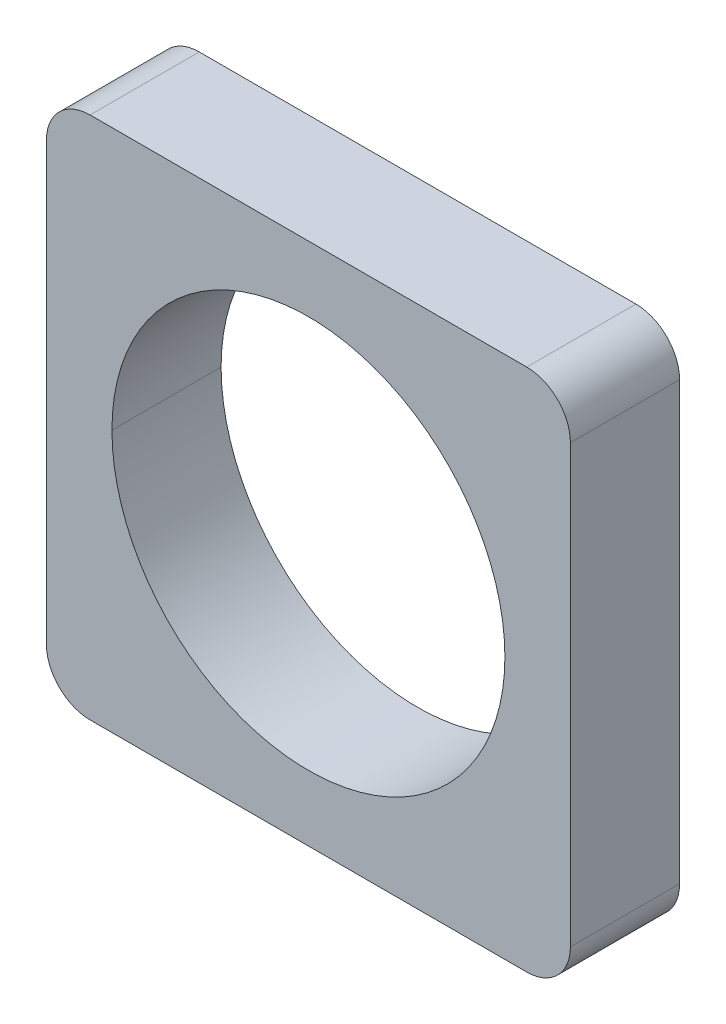
ISO-10303-21;
HEADER;
FILE_DESCRIPTION(('STEP AP214'),'2;1');
FILE_NAME('part.step','',(''),(''),'','','');
FILE_SCHEMA(('AUTOMOTIVE_DESIGN { 1 0 10303 214 1 1 1 1 }'));
ENDSEC;
DATA;
#1=APPLICATION_CONTEXT('core data for automotive mechanical design processes');
#2=APPLICATION_PROTOCOL_DEFINITION('international standard','automotive_design',2000,#1);
#3=PRODUCT_CONTEXT('',#1,'mechanical');
#4=PRODUCT('Part','Part','',(#3));
#5=PRODUCT_RELATED_PRODUCT_CATEGORY('part','',(#4));
#6=PRODUCT_DEFINITION_FORMATION('','',#4);
#7=PRODUCT_DEFINITION_CONTEXT('part definition',#1,'design');
#8=PRODUCT_DEFINITION('design','',#6,#7);
#9=PRODUCT_DEFINITION_SHAPE('','',#8);
#10=(LENGTH_UNIT() NAMED_UNIT(*) SI_UNIT(.MILLI.,.METRE.));
#11=(NAMED_UNIT(*) PLANE_ANGLE_UNIT() SI_UNIT($,.RADIAN.));
#12=(NAMED_UNIT(*) SI_UNIT($,.STERADIAN.) SOLID_ANGLE_UNIT());
#13=UNCERTAINTY_MEASURE_WITH_UNIT(LENGTH_MEASURE(1.E-05),#10,'distance_accuracy_value','');
#14=(GEOMETRIC_REPRESENTATION_CONTEXT(3) GLOBAL_UNCERTAINTY_ASSIGNED_CONTEXT((#13)) GLOBAL_UNIT_ASSIGNED_CONTEXT((#10,
#11,#12)) REPRESENTATION_CONTEXT('',''));
#15=CARTESIAN_POINT('',(0.,0.,0.));
#16=DIRECTION('',(0.,0.,1.));
#17=DIRECTION('',(1.,0.,0.));
#18=AXIS2_PLACEMENT_3D('',#15,#16,#17);
#19=CARTESIAN_POINT('',(-6.,6.,0.));
#20=DIRECTION('',(-1.,0.,0.));
#21=DIRECTION('',(0.,0.,1.));
#22=AXIS2_PLACEMENT_3D('',#19,#20,#21);
#23=PLANE('',#22);
#24=DIRECTION('',(0.,-1.,0.));
#25=VECTOR('',#24,1.);
#26=CARTESIAN_POINT('',(-6.,5.,0.));
#27=LINE('',#26,#25);
#28=CARTESIAN_POINT('',(-6.,5.,0.));
#29=VERTEX_POINT('',#28);
#30=CARTESIAN_POINT('',(-6.,-5.,0.));
#31=VERTEX_POINT('',#30);
#32=EDGE_CURVE('E173',#29,#31,#27,.T.);
#33=ORIENTED_EDGE('',*,*,#32,.T.);
#34=DIRECTION('',(0.,0.,-1.));
#35=VECTOR('',#34,1.);
#36=CARTESIAN_POINT('',(-6.,-5.,2.5));
#37=LINE('',#36,#35);
#38=CARTESIAN_POINT('',(-6.,-5.,2.5));
#39=VERTEX_POINT('',#38);
#40=EDGE_CURVE('E11',#39,#31,#37,.T.);
#41=ORIENTED_EDGE('',*,*,#40,.F.);
#42=DIRECTION('',(0.,-1.,0.));
#43=VECTOR('',#42,1.);
#44=CARTESIAN_POINT('',(-6.,5.,2.5));
#45=LINE('',#44,#43);
#46=CARTESIAN_POINT('',(-6.,5.,2.5));
#47=VERTEX_POINT('',#46);
#48=EDGE_CURVE('E21',#47,#39,#45,.T.);
#49=ORIENTED_EDGE('',*,*,#48,.F.);
#50=DIRECTION('',(0.,0.,-1.));
#51=VECTOR('',#50,1.);
#52=CARTESIAN_POINT('',(-6.,5.,2.5));
#53=LINE('',#52,#51);
#54=EDGE_CURVE('E162',#47,#29,#53,.T.);
#55=ORIENTED_EDGE('',*,*,#54,.T.);
#56=EDGE_LOOP('',(#33,#41,#49,#55));
#57=FACE_BOUND('',#56,.T.);
#58=ADVANCED_FACE('F17',(#57),#23,.T.);
#59=CARTESIAN_POINT('',(-5.,-5.,5.759));
#60=DIRECTION('',(0.,0.,-1.));
#61=DIRECTION('',(0.,-1.,0.));
#62=AXIS2_PLACEMENT_3D('',#59,#60,#61);
#63=CYLINDRICAL_SURFACE('',#62,1.);
#64=DIRECTION('',(0.,0.,-1.));
#65=VECTOR('',#64,1.);
#66=CARTESIAN_POINT('',(-5.,-6.,2.5));
#67=LINE('',#66,#65);
#68=CARTESIAN_POINT('',(-5.,-6.,2.5));
#69=VERTEX_POINT('',#68);
#70=CARTESIAN_POINT('',(-5.,-6.,0.));
#71=VERTEX_POINT('',#70);
#72=EDGE_CURVE('E28',#69,#71,#67,.T.);
#73=ORIENTED_EDGE('',*,*,#72,.F.);
#74=CARTESIAN_POINT('',(-5.,-5.,2.5));
#75=DIRECTION('',(0.,0.,1.));
#76=DIRECTION('',(-1.,0.,0.));
#77=AXIS2_PLACEMENT_3D('',#74,#75,#76);
#78=CIRCLE('',#77,1.);
#79=EDGE_CURVE('E192',#39,#69,#78,.T.);
#80=ORIENTED_EDGE('',*,*,#79,.F.);
#81=ORIENTED_EDGE('',*,*,#40,.T.);
#82=CARTESIAN_POINT('',(-5.,-5.,0.));
#83=DIRECTION('',(0.,0.,-1.));
#84=DIRECTION('',(0.,-1.,0.));
#85=AXIS2_PLACEMENT_3D('',#82,#83,#84);
#86=CIRCLE('',#85,1.);
#87=EDGE_CURVE('E178',#71,#31,#86,.T.);
#88=ORIENTED_EDGE('',*,*,#87,.F.);
#89=EDGE_LOOP('',(#73,#80,#81,#88));
#90=FACE_BOUND('',#89,.T.);
#91=ADVANCED_FACE('F227',(#90),#63,.T.);
#92=CARTESIAN_POINT('',(-6.,-6.,0.));
#93=DIRECTION('',(0.,-1.,0.));
#94=DIRECTION('',(0.,0.,-1.));
#95=AXIS2_PLACEMENT_3D('',#92,#93,#94);
#96=PLANE('',#95);
#97=DIRECTION('',(1.,0.,0.));
#98=VECTOR('',#97,1.);
#99=CARTESIAN_POINT('',(-5.,-6.,0.));
#100=LINE('',#99,#98);
#101=CARTESIAN_POINT('',(5.,-6.,0.));
#102=VERTEX_POINT('',#101);
#103=EDGE_CURVE('E204',#71,#102,#100,.T.);
#104=ORIENTED_EDGE('',*,*,#103,.T.);
#105=DIRECTION('',(0.,0.,-1.));
#106=VECTOR('',#105,1.);
#107=CARTESIAN_POINT('',(5.,-6.,2.5));
#108=LINE('',#107,#106);
#109=CARTESIAN_POINT('',(5.,-6.,2.5));
#110=VERTEX_POINT('',#109);
#111=EDGE_CURVE('E91',#110,#102,#108,.T.);
#112=ORIENTED_EDGE('',*,*,#111,.F.);
#113=DIRECTION('',(1.,0.,0.));
#114=VECTOR('',#113,1.);
#115=CARTESIAN_POINT('',(-5.,-6.,2.5));
#116=LINE('',#115,#114);
#117=EDGE_CURVE('E156',#69,#110,#116,.T.);
#118=ORIENTED_EDGE('',*,*,#117,.F.);
#119=ORIENTED_EDGE('',*,*,#72,.T.);
#120=EDGE_LOOP('',(#104,#112,#118,#119));
#121=FACE_BOUND('',#120,.T.);
#122=ADVANCED_FACE('F232',(#121),#96,.T.);
#123=CARTESIAN_POINT('',(5.,-5.,5.759));
#124=DIRECTION('',(0.,0.,-1.));
#125=DIRECTION('',(1.,0.,0.));
#126=AXIS2_PLACEMENT_3D('',#123,#124,#125);
#127=CYLINDRICAL_SURFACE('',#126,1.);
#128=DIRECTION('',(0.,0.,-1.));
#129=VECTOR('',#128,1.);
#130=CARTESIAN_POINT('',(6.,-5.,2.5));
#131=LINE('',#130,#129);
#132=CARTESIAN_POINT('',(6.,-5.,2.5));
#133=VERTEX_POINT('',#132);
#134=CARTESIAN_POINT('',(6.,-5.,0.));
#135=VERTEX_POINT('',#134);
#136=EDGE_CURVE('E107',#133,#135,#131,.T.);
#137=ORIENTED_EDGE('',*,*,#136,.F.);
#138=CARTESIAN_POINT('',(5.,-5.,2.5));
#139=DIRECTION('',(0.,0.,1.));
#140=DIRECTION('',(0.,-1.,0.));
#141=AXIS2_PLACEMENT_3D('',#138,#139,#140);
#142=CIRCLE('',#141,1.);
#143=EDGE_CURVE('E149',#110,#133,#142,.T.);
#144=ORIENTED_EDGE('',*,*,#143,.F.);
#145=ORIENTED_EDGE('',*,*,#111,.T.);
#146=CARTESIAN_POINT('',(5.,-5.,0.));
#147=DIRECTION('',(0.,0.,-1.));
#148=DIRECTION('',(1.,0.,0.));
#149=AXIS2_PLACEMENT_3D('',#146,#147,#148);
#150=CIRCLE('',#149,1.);
#151=EDGE_CURVE('E169',#135,#102,#150,.T.);
#152=ORIENTED_EDGE('',*,*,#151,.F.);
#153=EDGE_LOOP('',(#137,#144,#145,#152));
#154=FACE_BOUND('',#153,.T.);
#155=ADVANCED_FACE('F19',(#154),#127,.T.);
#156=CARTESIAN_POINT('',(6.,-6.,0.));
#157=DIRECTION('',(1.,0.,0.));
#158=DIRECTION('',(0.,1.,0.));
#159=AXIS2_PLACEMENT_3D('',#156,#157,#158);
#160=PLANE('',#159);
#161=DIRECTION('',(0.,1.,0.));
#162=VECTOR('',#161,1.);
#163=CARTESIAN_POINT('',(6.,-5.,2.5));
#164=LINE('',#163,#162);
#165=CARTESIAN_POINT('',(6.,5.,2.5));
#166=VERTEX_POINT('',#165);
#167=EDGE_CURVE('E128',#133,#166,#164,.T.);
#168=ORIENTED_EDGE('',*,*,#167,.F.);
#169=ORIENTED_EDGE('',*,*,#136,.T.);
#170=DIRECTION('',(0.,1.,0.));
#171=VECTOR('',#170,1.);
#172=CARTESIAN_POINT('',(6.,-5.,0.));
#173=LINE('',#172,#171);
#174=CARTESIAN_POINT('',(6.,5.,0.));
#175=VERTEX_POINT('',#174);
#176=EDGE_CURVE('E131',#135,#175,#173,.T.);
#177=ORIENTED_EDGE('',*,*,#176,.T.);
#178=DIRECTION('',(0.,0.,-1.));
#179=VECTOR('',#178,1.);
#180=CARTESIAN_POINT('',(6.,5.,2.5));
#181=LINE('',#180,#179);
#182=EDGE_CURVE('E124',#166,#175,#181,.T.);
#183=ORIENTED_EDGE('',*,*,#182,.F.);
#184=EDGE_LOOP('',(#168,#169,#177,#183));
#185=FACE_BOUND('',#184,.T.);
#186=ADVANCED_FACE('F126',(#185),#160,.T.);
#187=CARTESIAN_POINT('',(5.,5.,5.759));
#188=DIRECTION('',(0.,0.,-1.));
#189=DIRECTION('',(0.,1.,0.));
#190=AXIS2_PLACEMENT_3D('',#187,#188,#189);
#191=CYLINDRICAL_SURFACE('',#190,1.);
#192=DIRECTION('',(0.,0.,-1.));
#193=VECTOR('',#192,1.);
#194=CARTESIAN_POINT('',(5.,6.,2.5));
#195=LINE('',#194,#193);
#196=CARTESIAN_POINT('',(5.,6.,2.5));
#197=VERTEX_POINT('',#196);
#198=CARTESIAN_POINT('',(5.,6.,0.));
#199=VERTEX_POINT('',#198);
#200=EDGE_CURVE('E136',#197,#199,#195,.T.);
#201=ORIENTED_EDGE('',*,*,#200,.F.);
#202=CARTESIAN_POINT('',(5.,5.,2.5));
#203=DIRECTION('',(0.,0.,1.));
#204=DIRECTION('',(1.,0.,0.));
#205=AXIS2_PLACEMENT_3D('',#202,#203,#204);
#206=CIRCLE('',#205,1.);
#207=EDGE_CURVE('E139',#166,#197,#206,.T.);
#208=ORIENTED_EDGE('',*,*,#207,.F.);
#209=ORIENTED_EDGE('',*,*,#182,.T.);
#210=CARTESIAN_POINT('',(5.,5.,0.));
#211=DIRECTION('',(0.,0.,-1.));
#212=DIRECTION('',(0.,1.,0.));
#213=AXIS2_PLACEMENT_3D('',#210,#211,#212);
#214=CIRCLE('',#213,1.);
#215=EDGE_CURVE('E170',#199,#175,#214,.T.);
#216=ORIENTED_EDGE('',*,*,#215,.F.);
#217=EDGE_LOOP('',(#201,#208,#209,#216));
#218=FACE_BOUND('',#217,.T.);
#219=ADVANCED_FACE('F140',(#218),#191,.T.);
#220=CARTESIAN_POINT('',(6.,6.,0.));
#221=DIRECTION('',(0.,1.,0.));
#222=DIRECTION('',(1.,0.,0.));
#223=AXIS2_PLACEMENT_3D('',#220,#221,#222);
#224=PLANE('',#223);
#225=DIRECTION('',(-1.,0.,0.));
#226=VECTOR('',#225,1.);
#227=CARTESIAN_POINT('',(5.,6.,2.5));
#228=LINE('',#227,#226);
#229=CARTESIAN_POINT('',(-5.,6.,2.5));
#230=VERTEX_POINT('',#229);
#231=EDGE_CURVE('E144',#197,#230,#228,.T.);
#232=ORIENTED_EDGE('',*,*,#231,.F.);
#233=ORIENTED_EDGE('',*,*,#200,.T.);
#234=DIRECTION('',(-1.,0.,0.));
#235=VECTOR('',#234,1.);
#236=CARTESIAN_POINT('',(5.,6.,0.));
#237=LINE('',#236,#235);
#238=CARTESIAN_POINT('',(-5.,6.,0.));
#239=VERTEX_POINT('',#238);
#240=EDGE_CURVE('E369',#199,#239,#237,.T.);
#241=ORIENTED_EDGE('',*,*,#240,.T.);
#242=DIRECTION('',(0.,0.,-1.));
#243=VECTOR('',#242,1.);
#244=CARTESIAN_POINT('',(-5.,6.,2.5));
#245=LINE('',#244,#243);
#246=EDGE_CURVE('E42',#230,#239,#245,.T.);
#247=ORIENTED_EDGE('',*,*,#246,.F.);
#248=EDGE_LOOP('',(#232,#233,#241,#247));
#249=FACE_BOUND('',#248,.T.);
#250=ADVANCED_FACE('F257',(#249),#224,.T.);
#251=CARTESIAN_POINT('',(-5.,5.,5.759));
#252=DIRECTION('',(0.,0.,-1.));
#253=DIRECTION('',(-1.,0.,0.));
#254=AXIS2_PLACEMENT_3D('',#251,#252,#253);
#255=CYLINDRICAL_SURFACE('',#254,1.);
#256=ORIENTED_EDGE('',*,*,#54,.F.);
#257=CARTESIAN_POINT('',(-5.,5.,2.5));
#258=DIRECTION('',(0.,0.,1.));
#259=DIRECTION('',(0.,1.,0.));
#260=AXIS2_PLACEMENT_3D('',#257,#258,#259);
#261=CIRCLE('',#260,1.);
#262=EDGE_CURVE('E164',#230,#47,#261,.T.);
#263=ORIENTED_EDGE('',*,*,#262,.F.);
#264=ORIENTED_EDGE('',*,*,#246,.T.);
#265=CARTESIAN_POINT('',(-5.,5.,0.));
#266=DIRECTION('',(0.,0.,-1.));
#267=DIRECTION('',(-1.,0.,0.));
#268=AXIS2_PLACEMENT_3D('',#265,#266,#267);
#269=CIRCLE('',#268,1.);
#270=EDGE_CURVE('E177',#29,#239,#269,.T.);
#271=ORIENTED_EDGE('',*,*,#270,.F.);
#272=EDGE_LOOP('',(#256,#263,#264,#271));
#273=FACE_BOUND('',#272,.T.);
#274=ADVANCED_FACE('F261',(#273),#255,.T.);
#275=CARTESIAN_POINT('',(0.,0.,2.5));
#276=DIRECTION('',(0.,0.,1.));
#277=DIRECTION('',(1.,0.,0.));
#278=AXIS2_PLACEMENT_3D('',#275,#276,#277);
#279=PLANE('',#278);
#280=CARTESIAN_POINT('',(0.,0.,2.5));
#281=DIRECTION('',(0.,0.,-1.));
#282=DIRECTION('',(-1.,0.,0.));
#283=AXIS2_PLACEMENT_3D('',#280,#281,#282);
#284=CIRCLE('',#283,4.5);
#285=CARTESIAN_POINT('',(-4.5,0.,2.5));
#286=VERTEX_POINT('',#285);
#287=CARTESIAN_POINT('',(4.5,0.,2.5));
#288=VERTEX_POINT('',#287);
#289=EDGE_CURVE('E182',#286,#288,#284,.T.);
#290=ORIENTED_EDGE('',*,*,#289,.T.);
#291=CARTESIAN_POINT('',(0.,0.,2.5));
#292=DIRECTION('',(0.,0.,-1.));
#293=DIRECTION('',(1.,0.,0.));
#294=AXIS2_PLACEMENT_3D('',#291,#292,#293);
#295=CIRCLE('',#294,4.5);
#296=EDGE_CURVE('E160',#288,#286,#295,.T.);
#297=ORIENTED_EDGE('',*,*,#296,.T.);
#298=EDGE_LOOP('',(#290,#297));
#299=FACE_BOUND('',#298,.T.);
#300=ORIENTED_EDGE('',*,*,#48,.T.);
#301=ORIENTED_EDGE('',*,*,#79,.T.);
#302=ORIENTED_EDGE('',*,*,#117,.T.);
#303=ORIENTED_EDGE('',*,*,#143,.T.);
#304=ORIENTED_EDGE('',*,*,#167,.T.);
#305=ORIENTED_EDGE('',*,*,#207,.T.);
#306=ORIENTED_EDGE('',*,*,#231,.T.);
#307=ORIENTED_EDGE('',*,*,#262,.T.);
#308=EDGE_LOOP('',(#300,#301,#302,#303,#304,#305,#306,#307));
#309=FACE_BOUND('',#308,.T.);
#310=ADVANCED_FACE('F147',(#299,#309),#279,.T.);
#311=CARTESIAN_POINT('',(0.,0.,0.));
#312=DIRECTION('',(0.,0.,1.));
#313=DIRECTION('',(1.,0.,0.));
#314=AXIS2_PLACEMENT_3D('',#311,#312,#313);
#315=CYLINDRICAL_SURFACE('',#314,4.5);
#316=DIRECTION('',(0.,0.,1.));
#317=VECTOR('',#316,1.);
#318=CARTESIAN_POINT('',(4.5,0.,0.));
#319=LINE('',#318,#317);
#320=CARTESIAN_POINT('',(4.5,0.,0.));
#321=VERTEX_POINT('',#320);
#322=EDGE_CURVE('E179',#321,#288,#319,.T.);
#323=ORIENTED_EDGE('',*,*,#322,.T.);
#324=ORIENTED_EDGE('',*,*,#289,.F.);
#325=DIRECTION('',(0.,0.,1.));
#326=VECTOR('',#325,1.);
#327=CARTESIAN_POINT('',(-4.5,0.,0.));
#328=LINE('',#327,#326);
#329=CARTESIAN_POINT('',(-4.5,0.,0.));
#330=VERTEX_POINT('',#329);
#331=EDGE_CURVE('E190',#330,#286,#328,.T.);
#332=ORIENTED_EDGE('',*,*,#331,.F.);
#333=CARTESIAN_POINT('',(0.,0.,0.));
#334=DIRECTION('',(0.,0.,-1.));
#335=DIRECTION('',(-1.,0.,0.));
#336=AXIS2_PLACEMENT_3D('',#333,#334,#335);
#337=CIRCLE('',#336,4.5);
#338=EDGE_CURVE('E191',#330,#321,#337,.T.);
#339=ORIENTED_EDGE('',*,*,#338,.T.);
#340=EDGE_LOOP('',(#323,#324,#332,#339));
#341=FACE_BOUND('',#340,.T.);
#342=ADVANCED_FACE('F274',(#341),#315,.F.);
#343=CARTESIAN_POINT('',(0.,0.,0.));
#344=DIRECTION('',(0.,0.,1.));
#345=DIRECTION('',(1.,0.,0.));
#346=AXIS2_PLACEMENT_3D('',#343,#344,#345);
#347=CYLINDRICAL_SURFACE('',#346,4.5);
#348=ORIENTED_EDGE('',*,*,#331,.T.);
#349=ORIENTED_EDGE('',*,*,#296,.F.);
#350=ORIENTED_EDGE('',*,*,#322,.F.);
#351=CARTESIAN_POINT('',(0.,0.,0.));
#352=DIRECTION('',(0.,0.,-1.));
#353=DIRECTION('',(1.,0.,0.));
#354=AXIS2_PLACEMENT_3D('',#351,#352,#353);
#355=CIRCLE('',#354,4.5);
#356=EDGE_CURVE('E186',#321,#330,#355,.T.);
#357=ORIENTED_EDGE('',*,*,#356,.T.);
#358=EDGE_LOOP('',(#348,#349,#350,#357));
#359=FACE_BOUND('',#358,.T.);
#360=ADVANCED_FACE('F251',(#359),#347,.F.);
#361=CARTESIAN_POINT('',(0.,0.,0.));
#362=DIRECTION('',(0.,0.,1.));
#363=DIRECTION('',(1.,0.,0.));
#364=AXIS2_PLACEMENT_3D('',#361,#362,#363);
#365=PLANE('',#364);
#366=ORIENTED_EDGE('',*,*,#338,.F.);
#367=ORIENTED_EDGE('',*,*,#356,.F.);
#368=EDGE_LOOP('',(#366,#367));
#369=FACE_BOUND('',#368,.T.);
#370=ORIENTED_EDGE('',*,*,#240,.F.);
#371=ORIENTED_EDGE('',*,*,#215,.T.);
#372=ORIENTED_EDGE('',*,*,#176,.F.);
#373=ORIENTED_EDGE('',*,*,#151,.T.);
#374=ORIENTED_EDGE('',*,*,#103,.F.);
#375=ORIENTED_EDGE('',*,*,#87,.T.);
#376=ORIENTED_EDGE('',*,*,#32,.F.);
#377=ORIENTED_EDGE('',*,*,#270,.T.);
#378=EDGE_LOOP('',(#370,#371,#372,#373,#374,#375,#376,#377));
#379=FACE_BOUND('',#378,.T.);
#380=ADVANCED_FACE('F247',(#369,#379),#365,.F.);
#381=CLOSED_SHELL('',(#58,#91,#122,#155,#186,#219,#250,#274,#310,#342,#360,#380));
#382=MANIFOLD_SOLID_BREP('B1',#381);
#383=ADVANCED_BREP_SHAPE_REPRESENTATION('',(#18,#382),#14);
#384=SHAPE_DEFINITION_REPRESENTATION(#9,#383);
ENDSEC;
END-ISO-10303-21;
